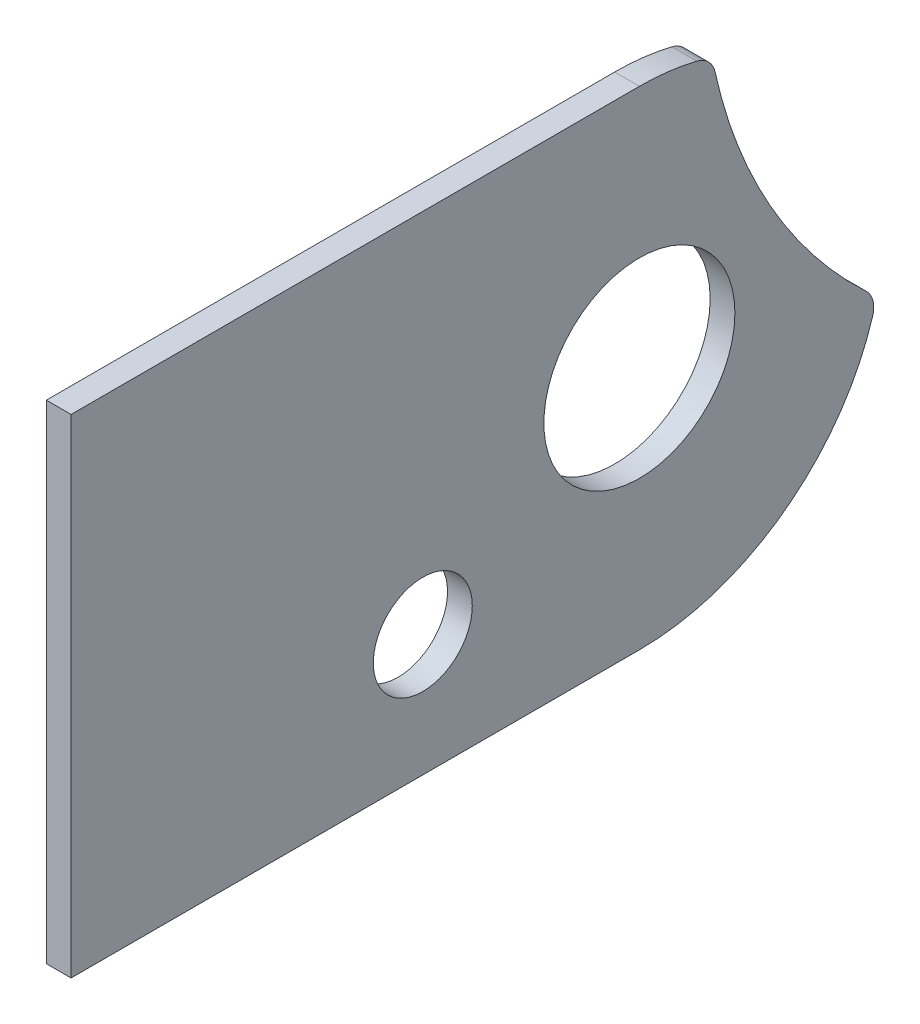
ISO-10303-21;
HEADER;
FILE_DESCRIPTION(('STEP AP214'),'2;1');
FILE_NAME('part.step','',(''),(''),'','','');
FILE_SCHEMA(('AUTOMOTIVE_DESIGN { 1 0 10303 214 1 1 1 1 }'));
ENDSEC;
DATA;
#1=APPLICATION_CONTEXT('core data for automotive mechanical design processes');
#2=APPLICATION_PROTOCOL_DEFINITION('international standard','automotive_design',2000,#1);
#3=PRODUCT_CONTEXT('',#1,'mechanical');
#4=PRODUCT('Part','Part','',(#3));
#5=PRODUCT_RELATED_PRODUCT_CATEGORY('part','',(#4));
#6=PRODUCT_DEFINITION_FORMATION('','',#4);
#7=PRODUCT_DEFINITION_CONTEXT('part definition',#1,'design');
#8=PRODUCT_DEFINITION('design','',#6,#7);
#9=PRODUCT_DEFINITION_SHAPE('','',#8);
#10=(LENGTH_UNIT() NAMED_UNIT(*) SI_UNIT(.MILLI.,.METRE.));
#11=(NAMED_UNIT(*) PLANE_ANGLE_UNIT() SI_UNIT($,.RADIAN.));
#12=(NAMED_UNIT(*) SI_UNIT($,.STERADIAN.) SOLID_ANGLE_UNIT());
#13=UNCERTAINTY_MEASURE_WITH_UNIT(LENGTH_MEASURE(1.E-05),#10,'distance_accuracy_value','');
#14=(GEOMETRIC_REPRESENTATION_CONTEXT(3) GLOBAL_UNCERTAINTY_ASSIGNED_CONTEXT((#13)) GLOBAL_UNIT_ASSIGNED_CONTEXT((#10,
#11,#12)) REPRESENTATION_CONTEXT('',''));
#15=CARTESIAN_POINT('',(0.,0.,0.));
#16=DIRECTION('',(0.,0.,1.));
#17=DIRECTION('',(1.,0.,0.));
#18=AXIS2_PLACEMENT_3D('',#15,#16,#17);
#19=CARTESIAN_POINT('',(-3.125,0.176593472475303,-11.4521055072078));
#20=DIRECTION('',(1.,0.,0.));
#21=DIRECTION('',(0.,0.,-1.));
#22=AXIS2_PLACEMENT_3D('',#19,#20,#21);
#23=CYLINDRICAL_SURFACE('',#22,36.975);
#24=CARTESIAN_POINT('',(0.625,0.176593472475303,-11.4521055072078));
#25=DIRECTION('',(1.,0.,0.));
#26=DIRECTION('',(0.,0.,-1.));
#27=AXIS2_PLACEMENT_3D('',#24,#25,#26);
#28=CIRCLE('',#27,36.975);
#29=CARTESIAN_POINT('',(0.625,36.1146167720679,-20.1474552021851));
#30=VERTEX_POINT('',#29);
#31=CARTESIAN_POINT('',(0.625,37.1515934724753,-11.4521055072078));
#32=VERTEX_POINT('',#31);
#33=EDGE_CURVE('E136',#30,#32,#28,.T.);
#34=ORIENTED_EDGE('',*,*,#33,.F.);
#35=DIRECTION('',(1.,0.,0.));
#36=VECTOR('',#35,1.);
#37=CARTESIAN_POINT('',(-3.125,36.1146167720679,-20.1474552021851));
#38=LINE('',#37,#36);
#39=CARTESIAN_POINT('',(-3.125,36.1146167720679,-20.1474552021851));
#40=VERTEX_POINT('',#39);
#41=EDGE_CURVE('E11',#30,#40,#38,.F.);
#42=ORIENTED_EDGE('',*,*,#41,.T.);
#43=CARTESIAN_POINT('',(-3.125,0.176593472475303,-11.4521055072078));
#44=DIRECTION('',(1.,0.,0.));
#45=DIRECTION('',(0.,0.,-1.));
#46=AXIS2_PLACEMENT_3D('',#43,#44,#45);
#47=CIRCLE('',#46,36.975);
#48=CARTESIAN_POINT('',(-3.125,37.1515934724753,-11.4521055072078));
#49=VERTEX_POINT('',#48);
#50=EDGE_CURVE('E102',#40,#49,#47,.T.);
#51=ORIENTED_EDGE('',*,*,#50,.T.);
#52=DIRECTION('',(1.,0.,0.));
#53=VECTOR('',#52,1.);
#54=CARTESIAN_POINT('',(-3.125,37.1515934724753,-11.4521055072078));
#55=LINE('',#54,#53);
#56=EDGE_CURVE('E104',#49,#32,#55,.T.);
#57=ORIENTED_EDGE('',*,*,#56,.T.);
#58=EDGE_LOOP('',(#34,#42,#51,#57));
#59=FACE_BOUND('',#58,.T.);
#60=ADVANCED_FACE('F36',(#59),#23,.T.);
#61=CARTESIAN_POINT('',(-3.125,-36.7984065275247,-11.4521055072078));
#62=VERTEX_POINT('',#61);
#63=CARTESIAN_POINT('',(-3.125,-10.7064667030425,-46.7891912135314));
#64=VERTEX_POINT('',#63);
#65=EDGE_CURVE('E110',#62,#64,#47,.T.);
#66=ORIENTED_EDGE('',*,*,#65,.T.);
#67=DIRECTION('',(1.,0.,0.));
#68=VECTOR('',#67,1.);
#69=CARTESIAN_POINT('',(-3.125,-10.7064667030425,-46.7891912135314));
#70=LINE('',#69,#68);
#71=CARTESIAN_POINT('',(0.625,-10.7064667030425,-46.7891912135314));
#72=VERTEX_POINT('',#71);
#73=EDGE_CURVE('E59',#64,#72,#70,.T.);
#74=ORIENTED_EDGE('',*,*,#73,.T.);
#75=CARTESIAN_POINT('',(0.625,-36.7984065275247,-11.4521055072078));
#76=VERTEX_POINT('',#75);
#77=EDGE_CURVE('E134',#76,#72,#28,.T.);
#78=ORIENTED_EDGE('',*,*,#77,.F.);
#79=DIRECTION('',(1.,0.,0.));
#80=VECTOR('',#79,1.);
#81=CARTESIAN_POINT('',(-3.125,-36.7984065275247,-11.4521055072078));
#82=LINE('',#81,#80);
#83=EDGE_CURVE('E143',#62,#76,#82,.T.);
#84=ORIENTED_EDGE('',*,*,#83,.F.);
#85=EDGE_LOOP('',(#66,#74,#78,#84));
#86=FACE_BOUND('',#85,.T.);
#87=ADVANCED_FACE('F179',(#86),#23,.T.);
#88=CARTESIAN_POINT('',(-3.125,-36.7984065275247,74.6584544927922));
#89=DIRECTION('',(0.,-1.,0.));
#90=DIRECTION('',(0.,0.,-1.));
#91=AXIS2_PLACEMENT_3D('',#88,#89,#90);
#92=PLANE('',#91);
#93=DIRECTION('',(0.,0.,-1.));
#94=VECTOR('',#93,1.);
#95=CARTESIAN_POINT('',(0.625,-36.7984065275247,74.6584544927922));
#96=LINE('',#95,#94);
#97=CARTESIAN_POINT('',(0.625,-36.7984065275247,74.6584544927922));
#98=VERTEX_POINT('',#97);
#99=EDGE_CURVE('E111',#98,#76,#96,.T.);
#100=ORIENTED_EDGE('',*,*,#99,.F.);
#101=DIRECTION('',(1.,0.,0.));
#102=VECTOR('',#101,1.);
#103=CARTESIAN_POINT('',(-3.125,-36.7984065275247,74.6584544927922));
#104=LINE('',#103,#102);
#105=CARTESIAN_POINT('',(-3.125,-36.7984065275247,74.6584544927922));
#106=VERTEX_POINT('',#105);
#107=EDGE_CURVE('E146',#106,#98,#104,.T.);
#108=ORIENTED_EDGE('',*,*,#107,.F.);
#109=DIRECTION('',(0.,0.,-1.));
#110=VECTOR('',#109,1.);
#111=CARTESIAN_POINT('',(-3.125,-36.7984065275247,74.6584544927922));
#112=LINE('',#111,#110);
#113=EDGE_CURVE('E120',#106,#62,#112,.T.);
#114=ORIENTED_EDGE('',*,*,#113,.T.);
#115=ORIENTED_EDGE('',*,*,#83,.T.);
#116=EDGE_LOOP('',(#100,#108,#114,#115));
#117=FACE_BOUND('',#116,.T.);
#118=ADVANCED_FACE('F182',(#117),#92,.T.);
#119=CARTESIAN_POINT('',(-3.125,37.1515934724753,74.6584544927922));
#120=DIRECTION('',(0.,0.,1.));
#121=DIRECTION('',(1.,0.,0.));
#122=AXIS2_PLACEMENT_3D('',#119,#120,#121);
#123=PLANE('',#122);
#124=DIRECTION('',(0.,-1.,0.));
#125=VECTOR('',#124,1.);
#126=CARTESIAN_POINT('',(0.625,37.1515934724753,74.6584544927922));
#127=LINE('',#126,#125);
#128=CARTESIAN_POINT('',(0.625,37.1515934724753,74.6584544927922));
#129=VERTEX_POINT('',#128);
#130=EDGE_CURVE('E138',#129,#98,#127,.T.);
#131=ORIENTED_EDGE('',*,*,#130,.F.);
#132=DIRECTION('',(1.,0.,0.));
#133=VECTOR('',#132,1.);
#134=CARTESIAN_POINT('',(-3.125,37.1515934724753,74.6584544927922));
#135=LINE('',#134,#133);
#136=CARTESIAN_POINT('',(-3.125,37.1515934724753,74.6584544927922));
#137=VERTEX_POINT('',#136);
#138=EDGE_CURVE('E119',#137,#129,#135,.T.);
#139=ORIENTED_EDGE('',*,*,#138,.F.);
#140=DIRECTION('',(0.,-1.,0.));
#141=VECTOR('',#140,1.);
#142=CARTESIAN_POINT('',(-3.125,37.1515934724753,74.6584544927922));
#143=LINE('',#142,#141);
#144=EDGE_CURVE('E127',#137,#106,#143,.T.);
#145=ORIENTED_EDGE('',*,*,#144,.T.);
#146=ORIENTED_EDGE('',*,*,#107,.T.);
#147=EDGE_LOOP('',(#131,#139,#145,#146));
#148=FACE_BOUND('',#147,.T.);
#149=ADVANCED_FACE('F185',(#148),#123,.T.);
#150=CARTESIAN_POINT('',(-3.125,37.1515934724753,-11.4521055072078));
#151=DIRECTION('',(0.,1.,0.));
#152=DIRECTION('',(0.,0.,1.));
#153=AXIS2_PLACEMENT_3D('',#150,#151,#152);
#154=PLANE('',#153);
#155=DIRECTION('',(0.,0.,1.));
#156=VECTOR('',#155,1.);
#157=CARTESIAN_POINT('',(0.625,37.1515934724753,-11.4521055072078));
#158=LINE('',#157,#156);
#159=EDGE_CURVE('E118',#32,#129,#158,.T.);
#160=ORIENTED_EDGE('',*,*,#159,.F.);
#161=ORIENTED_EDGE('',*,*,#56,.F.);
#162=DIRECTION('',(0.,0.,1.));
#163=VECTOR('',#162,1.);
#164=CARTESIAN_POINT('',(-3.125,37.1515934724753,-11.4521055072078));
#165=LINE('',#164,#163);
#166=EDGE_CURVE('E116',#49,#137,#165,.T.);
#167=ORIENTED_EDGE('',*,*,#166,.T.);
#168=ORIENTED_EDGE('',*,*,#138,.T.);
#169=EDGE_LOOP('',(#160,#161,#167,#168));
#170=FACE_BOUND('',#169,.T.);
#171=ADVANCED_FACE('F115',(#170),#154,.T.);
#172=CARTESIAN_POINT('',(-3.125,0.176593472475303,-11.4521055072078));
#173=DIRECTION('',(1.,0.,0.));
#174=DIRECTION('',(0.,0.,-1.));
#175=AXIS2_PLACEMENT_3D('',#172,#173,#174);
#176=PLANE('',#175);
#177=CARTESIAN_POINT('',(-3.125,-18.3577834775247,21.3675503927922));
#178=DIRECTION('',(1.,0.,0.));
#179=DIRECTION('',(0.,0.,-1.));
#180=AXIS2_PLACEMENT_3D('',#177,#178,#179);
#181=CIRCLE('',#180,7.5);
#182=CARTESIAN_POINT('',(-3.125,-18.3577834775247,13.8675503927922));
#183=VERTEX_POINT('',#182);
#184=EDGE_CURVE('E156',#183,#183,#181,.T.);
#185=ORIENTED_EDGE('',*,*,#184,.T.);
#186=EDGE_LOOP('',(#185));
#187=FACE_BOUND('',#186,.T.);
#188=CARTESIAN_POINT('',(-3.125,0.176593472475303,-11.4521055072078));
#189=DIRECTION('',(1.,0.,0.));
#190=DIRECTION('',(0.,0.,-1.));
#191=AXIS2_PLACEMENT_3D('',#188,#189,#190);
#192=CIRCLE('',#191,14.475);
#193=CARTESIAN_POINT('',(-3.125,0.176593472475303,-25.9271055072078));
#194=VERTEX_POINT('',#193);
#195=EDGE_CURVE('E186',#194,#194,#192,.T.);
#196=ORIENTED_EDGE('',*,*,#195,.T.);
#197=EDGE_LOOP('',(#196));
#198=FACE_BOUND('',#197,.T.);
#199=CARTESIAN_POINT('',(-3.125,50.1866975724753,-99.3415455072078));
#200=DIRECTION('',(1.,0.,0.));
#201=DIRECTION('',(0.,0.,-1.));
#202=AXIS2_PLACEMENT_3D('',#199,#200,#201);
#203=CIRCLE('',#202,78.2625);
#204=CARTESIAN_POINT('',(-3.125,33.2798879087659,-22.9270266430214));
#205=VERTEX_POINT('',#204);
#206=CARTESIAN_POINT('',(-3.125,-6.86885321146423,-45.7721229698004));
#207=VERTEX_POINT('',#206);
#208=EDGE_CURVE('E178',#205,#207,#203,.T.);
#209=ORIENTED_EDGE('',*,*,#208,.T.);
#210=CARTESIAN_POINT('',(-3.125,-9.6027080645519,-43.2053082818556));
#211=DIRECTION('',(1.,0.,0.));
#212=DIRECTION('',(0.,0.,-1.));
#213=AXIS2_PLACEMENT_3D('',#210,#211,#212);
#214=CIRCLE('',#213,3.75);
#215=EDGE_CURVE('E164',#207,#64,#214,.F.);
#216=ORIENTED_EDGE('',*,*,#215,.T.);
#217=ORIENTED_EDGE('',*,*,#65,.F.);
#218=ORIENTED_EDGE('',*,*,#113,.F.);
#219=ORIENTED_EDGE('',*,*,#144,.F.);
#220=ORIENTED_EDGE('',*,*,#166,.F.);
#221=ORIENTED_EDGE('',*,*,#50,.F.);
#222=CARTESIAN_POINT('',(-3.125,32.4697868228192,-19.2655738943781));
#223=DIRECTION('',(1.,0.,0.));
#224=DIRECTION('',(0.,0.,-1.));
#225=AXIS2_PLACEMENT_3D('',#222,#223,#224);
#226=CIRCLE('',#225,3.75);
#227=EDGE_CURVE('E162',#40,#205,#226,.F.);
#228=ORIENTED_EDGE('',*,*,#227,.T.);
#229=EDGE_LOOP('',(#209,#216,#217,#218,#219,#220,#221,#228));
#230=FACE_BOUND('',#229,.T.);
#231=ADVANCED_FACE('F124',(#187,#198,#230),#176,.F.);
#232=CARTESIAN_POINT('',(0.625,0.176593472475303,-11.4521055072078));
#233=DIRECTION('',(1.,0.,0.));
#234=DIRECTION('',(0.,0.,-1.));
#235=AXIS2_PLACEMENT_3D('',#232,#233,#234);
#236=PLANE('',#235);
#237=CARTESIAN_POINT('',(0.625,-18.3577834775247,21.3675503927922));
#238=DIRECTION('',(1.,0.,0.));
#239=DIRECTION('',(0.,0.,-1.));
#240=AXIS2_PLACEMENT_3D('',#237,#238,#239);
#241=CIRCLE('',#240,7.5);
#242=CARTESIAN_POINT('',(0.625,-18.3577834775247,13.8675503927922));
#243=VERTEX_POINT('',#242);
#244=EDGE_CURVE('E152',#243,#243,#241,.T.);
#245=ORIENTED_EDGE('',*,*,#244,.F.);
#246=EDGE_LOOP('',(#245));
#247=FACE_BOUND('',#246,.T.);
#248=ORIENTED_EDGE('',*,*,#77,.T.);
#249=CARTESIAN_POINT('',(0.625,-9.6027080645519,-43.2053082818556));
#250=DIRECTION('',(1.,0.,0.));
#251=DIRECTION('',(0.,0.,-1.));
#252=AXIS2_PLACEMENT_3D('',#249,#250,#251);
#253=CIRCLE('',#252,3.75);
#254=CARTESIAN_POINT('',(0.625,-6.86885321146423,-45.7721229698004));
#255=VERTEX_POINT('',#254);
#256=EDGE_CURVE('E44',#72,#255,#253,.T.);
#257=ORIENTED_EDGE('',*,*,#256,.T.);
#258=CARTESIAN_POINT('',(0.625,50.1866975724753,-99.3415455072078));
#259=DIRECTION('',(1.,0.,0.));
#260=DIRECTION('',(0.,0.,-1.));
#261=AXIS2_PLACEMENT_3D('',#258,#259,#260);
#262=CIRCLE('',#261,78.2625);
#263=CARTESIAN_POINT('',(0.625,33.2798879087659,-22.9270266430214));
#264=VERTEX_POINT('',#263);
#265=EDGE_CURVE('E145',#264,#255,#262,.T.);
#266=ORIENTED_EDGE('',*,*,#265,.F.);
#267=CARTESIAN_POINT('',(0.625,32.4697868228192,-19.2655738943781));
#268=DIRECTION('',(1.,0.,0.));
#269=DIRECTION('',(0.,0.,-1.));
#270=AXIS2_PLACEMENT_3D('',#267,#268,#269);
#271=CIRCLE('',#270,3.75);
#272=EDGE_CURVE('E51',#264,#30,#271,.T.);
#273=ORIENTED_EDGE('',*,*,#272,.T.);
#274=ORIENTED_EDGE('',*,*,#33,.T.);
#275=ORIENTED_EDGE('',*,*,#159,.T.);
#276=ORIENTED_EDGE('',*,*,#130,.T.);
#277=ORIENTED_EDGE('',*,*,#99,.T.);
#278=EDGE_LOOP('',(#248,#257,#266,#273,#274,#275,#276,#277));
#279=FACE_BOUND('',#278,.T.);
#280=CARTESIAN_POINT('',(0.625,0.176593472475303,-11.4521055072078));
#281=DIRECTION('',(1.,0.,0.));
#282=DIRECTION('',(0.,0.,-1.));
#283=AXIS2_PLACEMENT_3D('',#280,#281,#282);
#284=CIRCLE('',#283,14.475);
#285=CARTESIAN_POINT('',(0.625,0.176593472475303,-25.9271055072078));
#286=VERTEX_POINT('',#285);
#287=EDGE_CURVE('E155',#286,#286,#284,.T.);
#288=ORIENTED_EDGE('',*,*,#287,.F.);
#289=EDGE_LOOP('',(#288));
#290=FACE_BOUND('',#289,.T.);
#291=ADVANCED_FACE('F168',(#247,#279,#290),#236,.T.);
#292=CARTESIAN_POINT('',(-3.125,0.176593472475303,-11.4521055072078));
#293=DIRECTION('',(1.,0.,0.));
#294=DIRECTION('',(0.,0.,-1.));
#295=AXIS2_PLACEMENT_3D('',#292,#293,#294);
#296=CYLINDRICAL_SURFACE('',#295,14.475);
#297=ORIENTED_EDGE('',*,*,#195,.F.);
#298=EDGE_LOOP('',(#297));
#299=FACE_BOUND('',#298,.T.);
#300=ORIENTED_EDGE('',*,*,#287,.T.);
#301=EDGE_LOOP('',(#300));
#302=FACE_BOUND('',#301,.T.);
#303=ADVANCED_FACE('F206',(#299,#302),#296,.F.);
#304=CARTESIAN_POINT('',(-3.125,50.1866975724753,-99.3415455072078));
#305=DIRECTION('',(1.,0.,0.));
#306=DIRECTION('',(0.,0.,-1.));
#307=AXIS2_PLACEMENT_3D('',#304,#305,#306);
#308=CYLINDRICAL_SURFACE('',#307,78.2625);
#309=ORIENTED_EDGE('',*,*,#265,.T.);
#310=DIRECTION('',(1.,0.,0.));
#311=VECTOR('',#310,1.);
#312=CARTESIAN_POINT('',(-3.125,-6.86885321146422,-45.7721229698004));
#313=LINE('',#312,#311);
#314=EDGE_CURVE('E159',#255,#207,#313,.F.);
#315=ORIENTED_EDGE('',*,*,#314,.T.);
#316=ORIENTED_EDGE('',*,*,#208,.F.);
#317=DIRECTION('',(1.,0.,0.));
#318=VECTOR('',#317,1.);
#319=CARTESIAN_POINT('',(-3.125,33.2798879087659,-22.9270266430214));
#320=LINE('',#319,#318);
#321=EDGE_CURVE('E151',#205,#264,#320,.T.);
#322=ORIENTED_EDGE('',*,*,#321,.T.);
#323=EDGE_LOOP('',(#309,#315,#316,#322));
#324=FACE_BOUND('',#323,.T.);
#325=ADVANCED_FACE('F173',(#324),#308,.F.);
#326=CARTESIAN_POINT('',(-3.125,-18.3577834775247,21.3675503927922));
#327=DIRECTION('',(1.,0.,0.));
#328=DIRECTION('',(0.,0.,-1.));
#329=AXIS2_PLACEMENT_3D('',#326,#327,#328);
#330=CYLINDRICAL_SURFACE('',#329,7.5);
#331=ORIENTED_EDGE('',*,*,#244,.T.);
#332=EDGE_LOOP('',(#331));
#333=FACE_BOUND('',#332,.T.);
#334=ORIENTED_EDGE('',*,*,#184,.F.);
#335=EDGE_LOOP('',(#334));
#336=FACE_BOUND('',#335,.T.);
#337=ADVANCED_FACE('F198',(#333,#336),#330,.F.);
#338=CARTESIAN_POINT('',(-3.125,-9.6027080645519,-43.2053082818556));
#339=DIRECTION('',(1.,0.,0.));
#340=DIRECTION('',(0.,0.,-1.));
#341=AXIS2_PLACEMENT_3D('',#338,#339,#340);
#342=CYLINDRICAL_SURFACE('',#341,3.75);
#343=ORIENTED_EDGE('',*,*,#256,.F.);
#344=ORIENTED_EDGE('',*,*,#73,.F.);
#345=ORIENTED_EDGE('',*,*,#215,.F.);
#346=ORIENTED_EDGE('',*,*,#314,.F.);
#347=EDGE_LOOP('',(#343,#344,#345,#346));
#348=FACE_BOUND('',#347,.T.);
#349=ADVANCED_FACE('F176',(#348),#342,.T.);
#350=CARTESIAN_POINT('',(-3.125,32.4697868228192,-19.2655738943781));
#351=DIRECTION('',(-1.,0.,0.));
#352=DIRECTION('',(0.,0.,1.));
#353=AXIS2_PLACEMENT_3D('',#350,#351,#352);
#354=CYLINDRICAL_SURFACE('',#353,3.75);
#355=ORIENTED_EDGE('',*,*,#227,.F.);
#356=ORIENTED_EDGE('',*,*,#41,.F.);
#357=ORIENTED_EDGE('',*,*,#272,.F.);
#358=ORIENTED_EDGE('',*,*,#321,.F.);
#359=EDGE_LOOP('',(#355,#356,#357,#358));
#360=FACE_BOUND('',#359,.T.);
#361=ADVANCED_FACE('F38',(#360),#354,.T.);
#362=CLOSED_SHELL('',(#60,#87,#118,#149,#171,#231,#291,#303,#325,#337,#349,#361));
#363=MANIFOLD_SOLID_BREP('B2',#362);
#364=ADVANCED_BREP_SHAPE_REPRESENTATION('',(#18,#363),#14);
#365=SHAPE_DEFINITION_REPRESENTATION(#9,#364);
ENDSEC;
END-ISO-10303-21;
